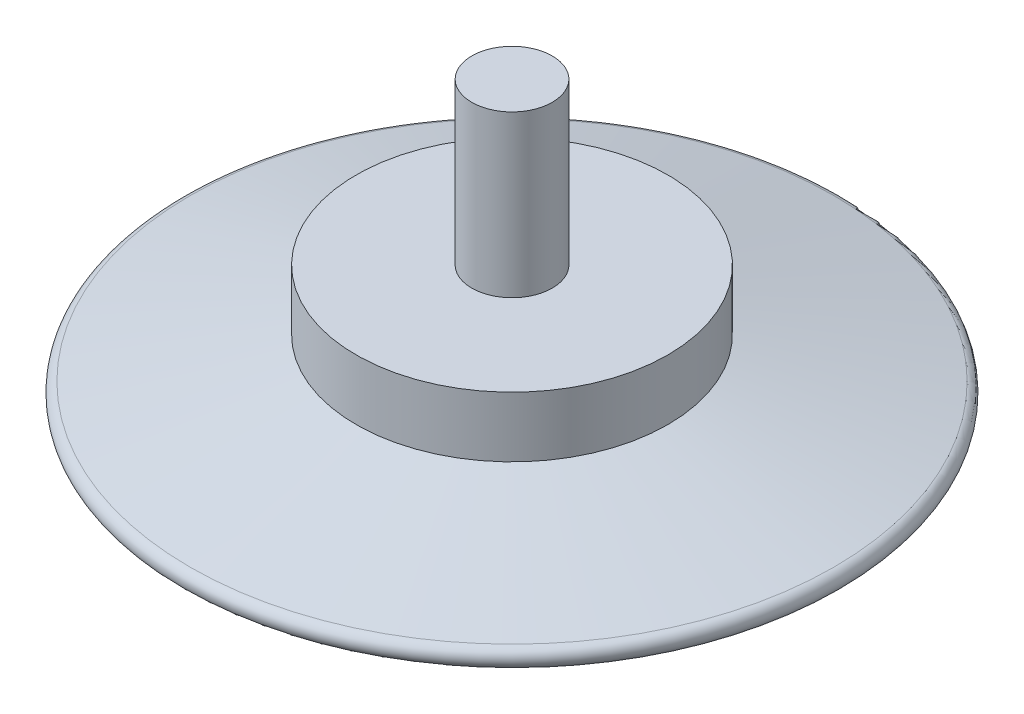
ISO-10303-21;
HEADER;
FILE_DESCRIPTION(('STEP AP214'),'2;1');
FILE_NAME('part.step','',(''),(''),'','','');
FILE_SCHEMA(('AUTOMOTIVE_DESIGN { 1 0 10303 214 1 1 1 1 }'));
ENDSEC;
DATA;
#1=APPLICATION_CONTEXT('core data for automotive mechanical design processes');
#2=APPLICATION_PROTOCOL_DEFINITION('international standard','automotive_design',2000,#1);
#3=PRODUCT_CONTEXT('',#1,'mechanical');
#4=PRODUCT('Part','Part','',(#3));
#5=PRODUCT_RELATED_PRODUCT_CATEGORY('part','',(#4));
#6=PRODUCT_DEFINITION_FORMATION('','',#4);
#7=PRODUCT_DEFINITION_CONTEXT('part definition',#1,'design');
#8=PRODUCT_DEFINITION('design','',#6,#7);
#9=PRODUCT_DEFINITION_SHAPE('','',#8);
#10=(LENGTH_UNIT() NAMED_UNIT(*) SI_UNIT(.MILLI.,.METRE.));
#11=(NAMED_UNIT(*) PLANE_ANGLE_UNIT() SI_UNIT($,.RADIAN.));
#12=(NAMED_UNIT(*) SI_UNIT($,.STERADIAN.) SOLID_ANGLE_UNIT());
#13=UNCERTAINTY_MEASURE_WITH_UNIT(LENGTH_MEASURE(1.E-05),#10,'distance_accuracy_value','');
#14=(GEOMETRIC_REPRESENTATION_CONTEXT(3) GLOBAL_UNCERTAINTY_ASSIGNED_CONTEXT((#13)) GLOBAL_UNIT_ASSIGNED_CONTEXT((#10,
#11,#12)) REPRESENTATION_CONTEXT('',''));
#15=CARTESIAN_POINT('',(0.,0.,0.));
#16=DIRECTION('',(0.,0.,1.));
#17=DIRECTION('',(1.,0.,0.));
#18=AXIS2_PLACEMENT_3D('',#15,#16,#17);
#19=CARTESIAN_POINT('',(0.,14.,0.));
#20=DIRECTION('',(0.,-1.,0.));
#21=DIRECTION('',(1.,0.,0.));
#22=AXIS2_PLACEMENT_3D('',#19,#20,#21);
#23=PLANE('',#22);
#24=CARTESIAN_POINT('',(0.,14.,0.));
#25=DIRECTION('',(0.,-1.,0.));
#26=DIRECTION('',(1.,0.,0.));
#27=AXIS2_PLACEMENT_3D('',#24,#25,#26);
#28=CIRCLE('',#27,2.);
#29=CARTESIAN_POINT('',(2.,14.,0.));
#30=VERTEX_POINT('',#29);
#31=EDGE_CURVE('E10',#30,#30,#28,.T.);
#32=ORIENTED_EDGE('',*,*,#31,.F.);
#33=EDGE_LOOP('',(#32));
#34=FACE_BOUND('',#33,.T.);
#35=ADVANCED_FACE('F41',(#34),#23,.F.);
#36=CARTESIAN_POINT('',(0.,0.,0.));
#37=DIRECTION('',(0.,-1.,0.));
#38=DIRECTION('',(1.,0.,0.));
#39=AXIS2_PLACEMENT_3D('',#36,#37,#38);
#40=CYLINDRICAL_SURFACE('',#39,2.);
#41=CARTESIAN_POINT('',(0.,6.,0.));
#42=DIRECTION('',(0.,-1.,0.));
#43=DIRECTION('',(1.,0.,0.));
#44=AXIS2_PLACEMENT_3D('',#41,#42,#43);
#45=CIRCLE('',#44,2.);
#46=CARTESIAN_POINT('',(2.,6.,0.));
#47=VERTEX_POINT('',#46);
#48=EDGE_CURVE('E47',#47,#47,#45,.T.);
#49=ORIENTED_EDGE('',*,*,#48,.F.);
#50=EDGE_LOOP('',(#49));
#51=FACE_BOUND('',#50,.T.);
#52=ORIENTED_EDGE('',*,*,#31,.T.);
#53=EDGE_LOOP('',(#52));
#54=FACE_BOUND('',#53,.T.);
#55=ADVANCED_FACE('F89',(#51,#54),#40,.T.);
#56=CARTESIAN_POINT('',(-2.,6.,0.));
#57=DIRECTION('',(0.,-1.,0.));
#58=DIRECTION('',(1.,0.,0.));
#59=AXIS2_PLACEMENT_3D('',#56,#57,#58);
#60=PLANE('',#59);
#61=CARTESIAN_POINT('',(0.,6.,0.));
#62=DIRECTION('',(0.,-1.,0.));
#63=DIRECTION('',(1.,0.,0.));
#64=AXIS2_PLACEMENT_3D('',#61,#62,#63);
#65=CIRCLE('',#64,7.75);
#66=CARTESIAN_POINT('',(7.75,6.,0.));
#67=VERTEX_POINT('',#66);
#68=EDGE_CURVE('E51',#67,#67,#65,.T.);
#69=ORIENTED_EDGE('',*,*,#68,.F.);
#70=EDGE_LOOP('',(#69));
#71=FACE_BOUND('',#70,.T.);
#72=ORIENTED_EDGE('',*,*,#48,.T.);
#73=EDGE_LOOP('',(#72));
#74=FACE_BOUND('',#73,.T.);
#75=ADVANCED_FACE('F84',(#71,#74),#60,.F.);
#76=CARTESIAN_POINT('',(0.,0.,0.));
#77=DIRECTION('',(0.,-1.,0.));
#78=DIRECTION('',(1.,0.,0.));
#79=AXIS2_PLACEMENT_3D('',#76,#77,#78);
#80=CYLINDRICAL_SURFACE('',#79,7.75);
#81=CARTESIAN_POINT('',(0.,3.,0.));
#82=DIRECTION('',(0.,-1.,0.));
#83=DIRECTION('',(1.,0.,0.));
#84=AXIS2_PLACEMENT_3D('',#81,#82,#83);
#85=CIRCLE('',#84,7.75);
#86=CARTESIAN_POINT('',(7.75,3.,0.));
#87=VERTEX_POINT('',#86);
#88=EDGE_CURVE('E55',#87,#87,#85,.T.);
#89=ORIENTED_EDGE('',*,*,#88,.F.);
#90=EDGE_LOOP('',(#89));
#91=FACE_BOUND('',#90,.T.);
#92=ORIENTED_EDGE('',*,*,#68,.T.);
#93=EDGE_LOOP('',(#92));
#94=FACE_BOUND('',#93,.T.);
#95=ADVANCED_FACE('F78',(#91,#94),#80,.T.);
#96=CARTESIAN_POINT('',(0.,3.,0.));
#97=DIRECTION('',(0.,-1.,0.));
#98=DIRECTION('',(1.,0.,0.));
#99=AXIS2_PLACEMENT_3D('',#96,#97,#98);
#100=CONICAL_SURFACE('',#99,7.75,1.33132759728292);
#101=CARTESIAN_POINT('',(0.,0.985732061078591,0.));
#102=DIRECTION('',(0.,-1.,0.));
#103=DIRECTION('',(1.,0.,0.));
#104=AXIS2_PLACEMENT_3D('',#101,#102,#103);
#105=CIRCLE('',#104,16.);
#106=CARTESIAN_POINT('',(16.,0.985732061078591,0.));
#107=VERTEX_POINT('',#106);
#108=EDGE_CURVE('E60',#107,#107,#105,.T.);
#109=ORIENTED_EDGE('',*,*,#108,.F.);
#110=EDGE_LOOP('',(#109));
#111=FACE_BOUND('',#110,.T.);
#112=ORIENTED_EDGE('',*,*,#88,.T.);
#113=EDGE_LOOP('',(#112));
#114=FACE_BOUND('',#113,.T.);
#115=ADVANCED_FACE('F72',(#111,#114),#100,.T.);
#116=CARTESIAN_POINT('',(0.,0.5,0.));
#117=DIRECTION('',(0.,-1.,0.));
#118=DIRECTION('',(1.,0.,0.));
#119=AXIS2_PLACEMENT_3D('',#116,#117,#118);
#120=TOROIDAL_SURFACE('',#119,15.8814067251471,0.500000000000001);
#121=CARTESIAN_POINT('',(0.,0.,0.));
#122=DIRECTION('',(0.,-1.,0.));
#123=DIRECTION('',(1.,0.,0.));
#124=AXIS2_PLACEMENT_3D('',#121,#122,#123);
#125=CIRCLE('',#124,15.8814067251471);
#126=CARTESIAN_POINT('',(15.8814067251471,0.,0.));
#127=VERTEX_POINT('',#126);
#128=EDGE_CURVE('E63',#127,#127,#125,.T.);
#129=ORIENTED_EDGE('',*,*,#128,.F.);
#130=EDGE_LOOP('',(#129));
#131=FACE_BOUND('',#130,.T.);
#132=ORIENTED_EDGE('',*,*,#108,.T.);
#133=EDGE_LOOP('',(#132));
#134=FACE_BOUND('',#133,.T.);
#135=ADVANCED_FACE('F69',(#131,#134),#120,.T.);
#136=CARTESIAN_POINT('',(-15.8814067251471,0.,0.));
#137=DIRECTION('',(0.,1.,0.));
#138=DIRECTION('',(-1.,0.,0.));
#139=AXIS2_PLACEMENT_3D('',#136,#137,#138);
#140=PLANE('',#139);
#141=ORIENTED_EDGE('',*,*,#128,.T.);
#142=EDGE_LOOP('',(#141));
#143=FACE_BOUND('',#142,.T.);
#144=ADVANCED_FACE('F67',(#143),#140,.F.);
#145=CLOSED_SHELL('',(#35,#55,#75,#95,#115,#135,#144));
#146=MANIFOLD_SOLID_BREP('B2',#145);
#147=ADVANCED_BREP_SHAPE_REPRESENTATION('',(#18,#146),#14);
#148=SHAPE_DEFINITION_REPRESENTATION(#9,#147);
ENDSEC;
END-ISO-10303-21;
